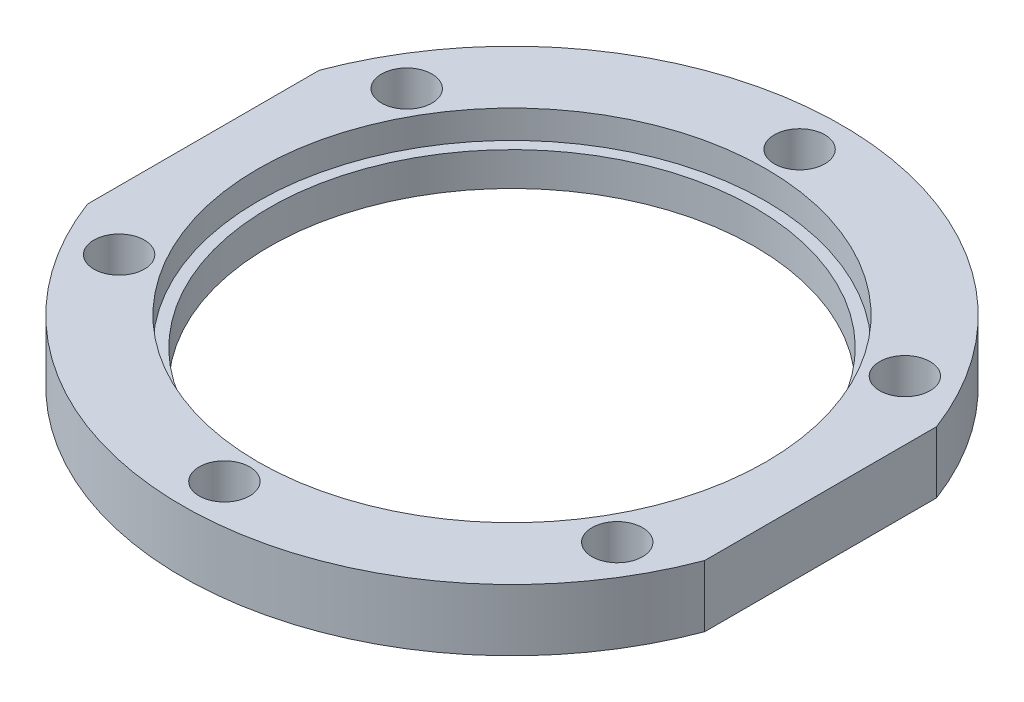
ISO-10303-21;
HEADER;
FILE_DESCRIPTION(('STEP AP214'),'2;1');
FILE_NAME('part.step','',(''),(''),'','','');
FILE_SCHEMA(('AUTOMOTIVE_DESIGN { 1 0 10303 214 1 1 1 1 }'));
ENDSEC;
DATA;
#1=APPLICATION_CONTEXT('core data for automotive mechanical design processes');
#2=APPLICATION_PROTOCOL_DEFINITION('international standard','automotive_design',2000,#1);
#3=PRODUCT_CONTEXT('',#1,'mechanical');
#4=PRODUCT('Part','Part','',(#3));
#5=PRODUCT_RELATED_PRODUCT_CATEGORY('part','',(#4));
#6=PRODUCT_DEFINITION_FORMATION('','',#4);
#7=PRODUCT_DEFINITION_CONTEXT('part definition',#1,'design');
#8=PRODUCT_DEFINITION('design','',#6,#7);
#9=PRODUCT_DEFINITION_SHAPE('','',#8);
#10=(LENGTH_UNIT() NAMED_UNIT(*) SI_UNIT(.MILLI.,.METRE.));
#11=(NAMED_UNIT(*) PLANE_ANGLE_UNIT() SI_UNIT($,.RADIAN.));
#12=(NAMED_UNIT(*) SI_UNIT($,.STERADIAN.) SOLID_ANGLE_UNIT());
#13=UNCERTAINTY_MEASURE_WITH_UNIT(LENGTH_MEASURE(1.E-05),#10,'distance_accuracy_value','');
#14=(GEOMETRIC_REPRESENTATION_CONTEXT(3) GLOBAL_UNCERTAINTY_ASSIGNED_CONTEXT((#13)) GLOBAL_UNIT_ASSIGNED_CONTEXT((#10,
#11,#12)) REPRESENTATION_CONTEXT('',''));
#15=CARTESIAN_POINT('',(0.,0.,0.));
#16=DIRECTION('',(0.,0.,1.));
#17=DIRECTION('',(1.,0.,0.));
#18=AXIS2_PLACEMENT_3D('',#15,#16,#17);
#19=CARTESIAN_POINT('',(0.,22.9348140994689,0.));
#20=DIRECTION('',(0.,1.,0.));
#21=DIRECTION('',(0.,0.,1.));
#22=AXIS2_PLACEMENT_3D('',#19,#20,#21);
#23=CYLINDRICAL_SURFACE('',#22,117.5);
#24=DIRECTION('',(0.,1.,0.));
#25=VECTOR('',#24,1.);
#26=CARTESIAN_POINT('',(110.,-22.,41.3067791046459));
#27=LINE('',#26,#25);
#28=CARTESIAN_POINT('',(110.,-22.,41.3067791046458));
#29=VERTEX_POINT('',#28);
#30=CARTESIAN_POINT('',(110.,0.,41.3067791046459));
#31=VERTEX_POINT('',#30);
#32=EDGE_CURVE('E50',#29,#31,#27,.T.);
#33=ORIENTED_EDGE('',*,*,#32,.T.);
#34=CARTESIAN_POINT('',(0.,0.,0.));
#35=DIRECTION('',(0.,1.,0.));
#36=DIRECTION('',(0.,0.,1.));
#37=AXIS2_PLACEMENT_3D('',#34,#35,#36);
#38=CIRCLE('',#37,117.5);
#39=CARTESIAN_POINT('',(-110.,0.,41.3067791046459));
#40=VERTEX_POINT('',#39);
#41=EDGE_CURVE('E43',#40,#31,#38,.T.);
#42=ORIENTED_EDGE('',*,*,#41,.F.);
#43=DIRECTION('',(0.,1.,0.));
#44=VECTOR('',#43,1.);
#45=CARTESIAN_POINT('',(-110.,-22.,41.3067791046459));
#46=LINE('',#45,#44);
#47=CARTESIAN_POINT('',(-110.,-22.,41.3067791046459));
#48=VERTEX_POINT('',#47);
#49=EDGE_CURVE('E111',#48,#40,#46,.T.);
#50=ORIENTED_EDGE('',*,*,#49,.F.);
#51=CARTESIAN_POINT('',(0.,-22.,0.));
#52=DIRECTION('',(0.,1.,0.));
#53=DIRECTION('',(0.,0.,1.));
#54=AXIS2_PLACEMENT_3D('',#51,#52,#53);
#55=CIRCLE('',#54,117.5);
#56=EDGE_CURVE('E92',#48,#29,#55,.T.);
#57=ORIENTED_EDGE('',*,*,#56,.T.);
#58=EDGE_LOOP('',(#33,#42,#50,#57));
#59=FACE_BOUND('',#58,.T.);
#60=ADVANCED_FACE('F35',(#59),#23,.T.);
#61=CARTESIAN_POINT('',(0.,22.9348140994689,0.));
#62=DIRECTION('',(0.,1.,0.));
#63=DIRECTION('',(0.,0.,1.));
#64=AXIS2_PLACEMENT_3D('',#61,#62,#63);
#65=CYLINDRICAL_SURFACE('',#64,90.5);
#66=CARTESIAN_POINT('',(0.,0.,0.));
#67=DIRECTION('',(0.,1.,0.));
#68=DIRECTION('',(0.,0.,1.));
#69=AXIS2_PLACEMENT_3D('',#66,#67,#68);
#70=CIRCLE('',#69,90.5);
#71=CARTESIAN_POINT('',(0.,0.,90.5));
#72=VERTEX_POINT('',#71);
#73=EDGE_CURVE('E11',#72,#72,#70,.T.);
#74=ORIENTED_EDGE('',*,*,#73,.T.);
#75=EDGE_LOOP('',(#74));
#76=FACE_BOUND('',#75,.T.);
#77=CARTESIAN_POINT('',(0.,-10.,0.));
#78=DIRECTION('',(0.,1.,0.));
#79=DIRECTION('',(0.,0.,1.));
#80=AXIS2_PLACEMENT_3D('',#77,#78,#79);
#81=CIRCLE('',#80,90.5);
#82=CARTESIAN_POINT('',(0.,-10.,90.5));
#83=VERTEX_POINT('',#82);
#84=EDGE_CURVE('E113',#83,#83,#81,.T.);
#85=ORIENTED_EDGE('',*,*,#84,.F.);
#86=EDGE_LOOP('',(#85));
#87=FACE_BOUND('',#86,.T.);
#88=ADVANCED_FACE('F37',(#76,#87),#65,.F.);
#89=CARTESIAN_POINT('',(-90.5,0.,0.));
#90=DIRECTION('',(0.,1.,0.));
#91=DIRECTION('',(0.,0.,1.));
#92=AXIS2_PLACEMENT_3D('',#89,#90,#91);
#93=PLANE('',#92);
#94=CARTESIAN_POINT('',(88.7676038879044,0.,-51.250000000001));
#95=DIRECTION('',(0.,1.,0.));
#96=DIRECTION('',(-0.866025403784433,0.,0.50000000000001));
#97=AXIS2_PLACEMENT_3D('',#94,#95,#96);
#98=CIRCLE('',#97,9.);
#99=CARTESIAN_POINT('',(80.9733752538445,0.,-46.7500000000009));
#100=VERTEX_POINT('',#99);
#101=EDGE_CURVE('E155',#100,#100,#98,.T.);
#102=ORIENTED_EDGE('',*,*,#101,.F.);
#103=EDGE_LOOP('',(#102));
#104=FACE_BOUND('',#103,.T.);
#105=CARTESIAN_POINT('',(88.7676038879054,0.,51.2499999999992));
#106=DIRECTION('',(0.,1.,0.));
#107=DIRECTION('',(-0.866025403784443,0.,-0.499999999999992));
#108=AXIS2_PLACEMENT_3D('',#105,#106,#107);
#109=CIRCLE('',#108,9.);
#110=CARTESIAN_POINT('',(80.9733752538454,0.,46.7499999999992));
#111=VERTEX_POINT('',#110);
#112=EDGE_CURVE('E159',#111,#111,#109,.T.);
#113=ORIENTED_EDGE('',*,*,#112,.F.);
#114=EDGE_LOOP('',(#113));
#115=FACE_BOUND('',#114,.T.);
#116=CARTESIAN_POINT('',(0.,0.,102.5));
#117=DIRECTION('',(0.,1.,0.));
#118=DIRECTION('',(0.,0.,-1.));
#119=AXIS2_PLACEMENT_3D('',#116,#117,#118);
#120=CIRCLE('',#119,9.);
#121=CARTESIAN_POINT('',(0.,0.,93.5));
#122=VERTEX_POINT('',#121);
#123=EDGE_CURVE('E163',#122,#122,#120,.T.);
#124=ORIENTED_EDGE('',*,*,#123,.F.);
#125=EDGE_LOOP('',(#124));
#126=FACE_BOUND('',#125,.T.);
#127=CARTESIAN_POINT('',(-88.7676038879047,0.,51.2500000000004));
#128=DIRECTION('',(0.,1.,0.));
#129=DIRECTION('',(0.866025403784436,0.,-0.500000000000004));
#130=AXIS2_PLACEMENT_3D('',#127,#128,#129);
#131=CIRCLE('',#130,9.);
#132=CARTESIAN_POINT('',(-80.9733752538448,0.,46.7500000000004));
#133=VERTEX_POINT('',#132);
#134=EDGE_CURVE('E167',#133,#133,#131,.T.);
#135=ORIENTED_EDGE('',*,*,#134,.F.);
#136=EDGE_LOOP('',(#135));
#137=FACE_BOUND('',#136,.T.);
#138=CARTESIAN_POINT('',(-88.7676038879051,0.,-51.2499999999998));
#139=DIRECTION('',(0.,1.,0.));
#140=DIRECTION('',(0.86602540378444,0.,0.499999999999998));
#141=AXIS2_PLACEMENT_3D('',#138,#139,#140);
#142=CIRCLE('',#141,9.);
#143=CARTESIAN_POINT('',(-80.9733752538451,0.,-46.7499999999998));
#144=VERTEX_POINT('',#143);
#145=EDGE_CURVE('E171',#144,#144,#142,.T.);
#146=ORIENTED_EDGE('',*,*,#145,.F.);
#147=EDGE_LOOP('',(#146));
#148=FACE_BOUND('',#147,.T.);
#149=CARTESIAN_POINT('',(0.,0.,-102.5));
#150=DIRECTION('',(0.,1.,0.));
#151=DIRECTION('',(0.,0.,1.));
#152=AXIS2_PLACEMENT_3D('',#149,#150,#151);
#153=CIRCLE('',#152,9.);
#154=CARTESIAN_POINT('',(0.,0.,-93.5));
#155=VERTEX_POINT('',#154);
#156=EDGE_CURVE('E174',#155,#155,#153,.T.);
#157=ORIENTED_EDGE('',*,*,#156,.F.);
#158=EDGE_LOOP('',(#157));
#159=FACE_BOUND('',#158,.T.);
#160=DIRECTION('',(0.,0.,1.));
#161=VECTOR('',#160,1.);
#162=CARTESIAN_POINT('',(110.,0.,-41.306779104646));
#163=LINE('',#162,#161);
#164=CARTESIAN_POINT('',(110.,0.,-41.306779104646));
#165=VERTEX_POINT('',#164);
#166=EDGE_CURVE('E82',#165,#31,#163,.T.);
#167=ORIENTED_EDGE('',*,*,#166,.F.);
#168=CARTESIAN_POINT('',(-110.,0.,-41.3067791046459));
#169=VERTEX_POINT('',#168);
#170=EDGE_CURVE('E86',#165,#169,#38,.T.);
#171=ORIENTED_EDGE('',*,*,#170,.T.);
#172=DIRECTION('',(0.,0.,-1.));
#173=VECTOR('',#172,1.);
#174=CARTESIAN_POINT('',(-110.,0.,-41.3067791046459));
#175=LINE('',#174,#173);
#176=EDGE_CURVE('E106',#40,#169,#175,.T.);
#177=ORIENTED_EDGE('',*,*,#176,.F.);
#178=ORIENTED_EDGE('',*,*,#41,.T.);
#179=EDGE_LOOP('',(#167,#171,#177,#178));
#180=FACE_BOUND('',#179,.T.);
#181=ORIENTED_EDGE('',*,*,#73,.F.);
#182=EDGE_LOOP('',(#181));
#183=FACE_BOUND('',#182,.T.);
#184=ADVANCED_FACE('F104',(#104,#115,#126,#137,#148,#159,#180,#183),#93,.T.);
#185=DIRECTION('',(0.,1.,0.));
#186=VECTOR('',#185,1.);
#187=CARTESIAN_POINT('',(110.,-22.,-41.306779104646));
#188=LINE('',#187,#186);
#189=CARTESIAN_POINT('',(110.,-22.,-41.306779104646));
#190=VERTEX_POINT('',#189);
#191=EDGE_CURVE('E77',#190,#165,#188,.T.);
#192=ORIENTED_EDGE('',*,*,#191,.F.);
#193=CARTESIAN_POINT('',(-110.,-22.,-41.3067791046459));
#194=VERTEX_POINT('',#193);
#195=EDGE_CURVE('E58',#190,#194,#55,.T.);
#196=ORIENTED_EDGE('',*,*,#195,.T.);
#197=DIRECTION('',(0.,1.,0.));
#198=VECTOR('',#197,1.);
#199=CARTESIAN_POINT('',(-110.,-22.,-41.3067791046459));
#200=LINE('',#199,#198);
#201=EDGE_CURVE('E109',#194,#169,#200,.T.);
#202=ORIENTED_EDGE('',*,*,#201,.T.);
#203=ORIENTED_EDGE('',*,*,#170,.F.);
#204=EDGE_LOOP('',(#192,#196,#202,#203));
#205=FACE_BOUND('',#204,.T.);
#206=ADVANCED_FACE('F85',(#205),#23,.T.);
#207=CARTESIAN_POINT('',(-117.5,-22.,0.));
#208=DIRECTION('',(0.,-1.,0.));
#209=DIRECTION('',(0.,0.,-1.));
#210=AXIS2_PLACEMENT_3D('',#207,#208,#209);
#211=PLANE('',#210);
#212=CARTESIAN_POINT('',(88.7676038879044,-22.,-51.250000000001));
#213=DIRECTION('',(0.,1.,0.));
#214=DIRECTION('',(-0.866025403784433,0.,0.50000000000001));
#215=AXIS2_PLACEMENT_3D('',#212,#213,#214);
#216=CIRCLE('',#215,9.);
#217=CARTESIAN_POINT('',(80.9733752538445,-22.,-46.7500000000009));
#218=VERTEX_POINT('',#217);
#219=EDGE_CURVE('E197',#218,#218,#216,.T.);
#220=ORIENTED_EDGE('',*,*,#219,.T.);
#221=EDGE_LOOP('',(#220));
#222=FACE_BOUND('',#221,.T.);
#223=CARTESIAN_POINT('',(88.7676038879054,-22.,51.2499999999992));
#224=DIRECTION('',(0.,1.,0.));
#225=DIRECTION('',(-0.866025403784443,0.,-0.499999999999992));
#226=AXIS2_PLACEMENT_3D('',#223,#224,#225);
#227=CIRCLE('',#226,9.);
#228=CARTESIAN_POINT('',(80.9733752538454,-22.,46.7499999999992));
#229=VERTEX_POINT('',#228);
#230=EDGE_CURVE('E193',#229,#229,#227,.T.);
#231=ORIENTED_EDGE('',*,*,#230,.T.);
#232=EDGE_LOOP('',(#231));
#233=FACE_BOUND('',#232,.T.);
#234=CARTESIAN_POINT('',(0.,-22.,102.5));
#235=DIRECTION('',(0.,1.,0.));
#236=DIRECTION('',(0.,0.,-1.));
#237=AXIS2_PLACEMENT_3D('',#234,#235,#236);
#238=CIRCLE('',#237,9.);
#239=CARTESIAN_POINT('',(0.,-22.,93.5));
#240=VERTEX_POINT('',#239);
#241=EDGE_CURVE('E189',#240,#240,#238,.T.);
#242=ORIENTED_EDGE('',*,*,#241,.T.);
#243=EDGE_LOOP('',(#242));
#244=FACE_BOUND('',#243,.T.);
#245=CARTESIAN_POINT('',(-88.7676038879047,-22.,51.2500000000004));
#246=DIRECTION('',(0.,1.,0.));
#247=DIRECTION('',(0.866025403784436,0.,-0.500000000000004));
#248=AXIS2_PLACEMENT_3D('',#245,#246,#247);
#249=CIRCLE('',#248,9.);
#250=CARTESIAN_POINT('',(-80.9733752538448,-22.,46.7500000000004));
#251=VERTEX_POINT('',#250);
#252=EDGE_CURVE('E186',#251,#251,#249,.T.);
#253=ORIENTED_EDGE('',*,*,#252,.T.);
#254=EDGE_LOOP('',(#253));
#255=FACE_BOUND('',#254,.T.);
#256=CARTESIAN_POINT('',(-88.7676038879051,-22.,-51.2499999999998));
#257=DIRECTION('',(0.,1.,0.));
#258=DIRECTION('',(0.86602540378444,0.,0.499999999999998));
#259=AXIS2_PLACEMENT_3D('',#256,#257,#258);
#260=CIRCLE('',#259,9.);
#261=CARTESIAN_POINT('',(-80.9733752538451,-22.,-46.7499999999998));
#262=VERTEX_POINT('',#261);
#263=EDGE_CURVE('E177',#262,#262,#260,.T.);
#264=ORIENTED_EDGE('',*,*,#263,.T.);
#265=EDGE_LOOP('',(#264));
#266=FACE_BOUND('',#265,.T.);
#267=CARTESIAN_POINT('',(0.,-22.,-102.5));
#268=DIRECTION('',(0.,1.,0.));
#269=DIRECTION('',(0.,0.,1.));
#270=AXIS2_PLACEMENT_3D('',#267,#268,#269);
#271=CIRCLE('',#270,9.);
#272=CARTESIAN_POINT('',(0.,-22.,-93.5));
#273=VERTEX_POINT('',#272);
#274=EDGE_CURVE('E176',#273,#273,#271,.T.);
#275=ORIENTED_EDGE('',*,*,#274,.T.);
#276=EDGE_LOOP('',(#275));
#277=FACE_BOUND('',#276,.T.);
#278=DIRECTION('',(0.,0.,1.));
#279=VECTOR('',#278,1.);
#280=CARTESIAN_POINT('',(110.,-22.,-41.306779104646));
#281=LINE('',#280,#279);
#282=EDGE_CURVE('E75',#190,#29,#281,.T.);
#283=ORIENTED_EDGE('',*,*,#282,.T.);
#284=ORIENTED_EDGE('',*,*,#56,.F.);
#285=DIRECTION('',(0.,0.,-1.));
#286=VECTOR('',#285,1.);
#287=CARTESIAN_POINT('',(-110.,-22.,-41.3067791046459));
#288=LINE('',#287,#286);
#289=EDGE_CURVE('E91',#48,#194,#288,.T.);
#290=ORIENTED_EDGE('',*,*,#289,.T.);
#291=ORIENTED_EDGE('',*,*,#195,.F.);
#292=EDGE_LOOP('',(#283,#284,#290,#291));
#293=FACE_BOUND('',#292,.T.);
#294=CARTESIAN_POINT('',(0.,-22.,0.));
#295=DIRECTION('',(0.,1.,0.));
#296=DIRECTION('',(0.,0.,1.));
#297=AXIS2_PLACEMENT_3D('',#294,#295,#296);
#298=CIRCLE('',#297,86.5);
#299=CARTESIAN_POINT('',(0.,-22.,86.5));
#300=VERTEX_POINT('',#299);
#301=EDGE_CURVE('E93',#300,#300,#298,.T.);
#302=ORIENTED_EDGE('',*,*,#301,.T.);
#303=EDGE_LOOP('',(#302));
#304=FACE_BOUND('',#303,.T.);
#305=ADVANCED_FACE('F89',(#222,#233,#244,#255,#266,#277,#293,#304),#211,.T.);
#306=CARTESIAN_POINT('',(0.,22.9348140994689,0.));
#307=DIRECTION('',(0.,1.,0.));
#308=DIRECTION('',(0.,0.,1.));
#309=AXIS2_PLACEMENT_3D('',#306,#307,#308);
#310=CYLINDRICAL_SURFACE('',#309,86.5);
#311=CARTESIAN_POINT('',(0.,-10.,0.));
#312=DIRECTION('',(0.,1.,0.));
#313=DIRECTION('',(0.,0.,1.));
#314=AXIS2_PLACEMENT_3D('',#311,#312,#313);
#315=CIRCLE('',#314,86.5);
#316=CARTESIAN_POINT('',(0.,-10.,86.5));
#317=VERTEX_POINT('',#316);
#318=EDGE_CURVE('E96',#317,#317,#315,.T.);
#319=ORIENTED_EDGE('',*,*,#318,.T.);
#320=EDGE_LOOP('',(#319));
#321=FACE_BOUND('',#320,.T.);
#322=ORIENTED_EDGE('',*,*,#301,.F.);
#323=EDGE_LOOP('',(#322));
#324=FACE_BOUND('',#323,.T.);
#325=ADVANCED_FACE('F122',(#321,#324),#310,.F.);
#326=CARTESIAN_POINT('',(-86.5,-10.,0.));
#327=DIRECTION('',(0.,1.,0.));
#328=DIRECTION('',(0.,0.,1.));
#329=AXIS2_PLACEMENT_3D('',#326,#327,#328);
#330=PLANE('',#329);
#331=ORIENTED_EDGE('',*,*,#84,.T.);
#332=EDGE_LOOP('',(#331));
#333=FACE_BOUND('',#332,.T.);
#334=ORIENTED_EDGE('',*,*,#318,.F.);
#335=EDGE_LOOP('',(#334));
#336=FACE_BOUND('',#335,.T.);
#337=ADVANCED_FACE('F125',(#333,#336),#330,.T.);
#338=CARTESIAN_POINT('',(-110.,-22.,-41.3067791046459));
#339=DIRECTION('',(1.,0.,0.));
#340=DIRECTION('',(0.,0.,-1.));
#341=AXIS2_PLACEMENT_3D('',#338,#339,#340);
#342=PLANE('',#341);
#343=ORIENTED_EDGE('',*,*,#176,.T.);
#344=ORIENTED_EDGE('',*,*,#201,.F.);
#345=ORIENTED_EDGE('',*,*,#289,.F.);
#346=ORIENTED_EDGE('',*,*,#49,.T.);
#347=EDGE_LOOP('',(#343,#344,#345,#346));
#348=FACE_BOUND('',#347,.T.);
#349=ADVANCED_FACE('F108',(#348),#342,.F.);
#350=CARTESIAN_POINT('',(110.,-22.,-41.306779104646));
#351=DIRECTION('',(-1.,0.,0.));
#352=DIRECTION('',(0.,0.,1.));
#353=AXIS2_PLACEMENT_3D('',#350,#351,#352);
#354=PLANE('',#353);
#355=ORIENTED_EDGE('',*,*,#166,.T.);
#356=ORIENTED_EDGE('',*,*,#32,.F.);
#357=ORIENTED_EDGE('',*,*,#282,.F.);
#358=ORIENTED_EDGE('',*,*,#191,.T.);
#359=EDGE_LOOP('',(#355,#356,#357,#358));
#360=FACE_BOUND('',#359,.T.);
#361=ADVANCED_FACE('F76',(#360),#354,.F.);
#362=CARTESIAN_POINT('',(0.,-22.,-102.5));
#363=DIRECTION('',(0.,1.,0.));
#364=DIRECTION('',(0.,0.,1.));
#365=AXIS2_PLACEMENT_3D('',#362,#363,#364);
#366=CYLINDRICAL_SURFACE('',#365,9.);
#367=ORIENTED_EDGE('',*,*,#274,.F.);
#368=EDGE_LOOP('',(#367));
#369=FACE_BOUND('',#368,.T.);
#370=ORIENTED_EDGE('',*,*,#156,.T.);
#371=EDGE_LOOP('',(#370));
#372=FACE_BOUND('',#371,.T.);
#373=ADVANCED_FACE('F227',(#369,#372),#366,.F.);
#374=CARTESIAN_POINT('',(-88.7676038879051,-22.,-51.2499999999998));
#375=DIRECTION('',(0.,1.,0.));
#376=DIRECTION('',(0.,0.,1.));
#377=AXIS2_PLACEMENT_3D('',#374,#375,#376);
#378=CYLINDRICAL_SURFACE('',#377,9.);
#379=ORIENTED_EDGE('',*,*,#263,.F.);
#380=EDGE_LOOP('',(#379));
#381=FACE_BOUND('',#380,.T.);
#382=ORIENTED_EDGE('',*,*,#145,.T.);
#383=EDGE_LOOP('',(#382));
#384=FACE_BOUND('',#383,.T.);
#385=ADVANCED_FACE('F223',(#381,#384),#378,.F.);
#386=CARTESIAN_POINT('',(-88.7676038879047,-22.,51.2500000000004));
#387=DIRECTION('',(0.,1.,0.));
#388=DIRECTION('',(0.,0.,1.));
#389=AXIS2_PLACEMENT_3D('',#386,#387,#388);
#390=CYLINDRICAL_SURFACE('',#389,9.);
#391=ORIENTED_EDGE('',*,*,#252,.F.);
#392=EDGE_LOOP('',(#391));
#393=FACE_BOUND('',#392,.T.);
#394=ORIENTED_EDGE('',*,*,#134,.T.);
#395=EDGE_LOOP('',(#394));
#396=FACE_BOUND('',#395,.T.);
#397=ADVANCED_FACE('F219',(#393,#396),#390,.F.);
#398=CARTESIAN_POINT('',(0.,-22.,102.5));
#399=DIRECTION('',(0.,1.,0.));
#400=DIRECTION('',(0.,0.,1.));
#401=AXIS2_PLACEMENT_3D('',#398,#399,#400);
#402=CYLINDRICAL_SURFACE('',#401,9.);
#403=ORIENTED_EDGE('',*,*,#241,.F.);
#404=EDGE_LOOP('',(#403));
#405=FACE_BOUND('',#404,.T.);
#406=ORIENTED_EDGE('',*,*,#123,.T.);
#407=EDGE_LOOP('',(#406));
#408=FACE_BOUND('',#407,.T.);
#409=ADVANCED_FACE('F213',(#405,#408),#402,.F.);
#410=CARTESIAN_POINT('',(88.7676038879054,-22.,51.2499999999992));
#411=DIRECTION('',(0.,1.,0.));
#412=DIRECTION('',(0.,0.,1.));
#413=AXIS2_PLACEMENT_3D('',#410,#411,#412);
#414=CYLINDRICAL_SURFACE('',#413,9.);
#415=ORIENTED_EDGE('',*,*,#230,.F.);
#416=EDGE_LOOP('',(#415));
#417=FACE_BOUND('',#416,.T.);
#418=ORIENTED_EDGE('',*,*,#112,.T.);
#419=EDGE_LOOP('',(#418));
#420=FACE_BOUND('',#419,.T.);
#421=ADVANCED_FACE('F208',(#417,#420),#414,.F.);
#422=CARTESIAN_POINT('',(88.7676038879044,-22.,-51.250000000001));
#423=DIRECTION('',(0.,1.,0.));
#424=DIRECTION('',(0.,0.,1.));
#425=AXIS2_PLACEMENT_3D('',#422,#423,#424);
#426=CYLINDRICAL_SURFACE('',#425,9.);
#427=ORIENTED_EDGE('',*,*,#219,.F.);
#428=EDGE_LOOP('',(#427));
#429=FACE_BOUND('',#428,.T.);
#430=ORIENTED_EDGE('',*,*,#101,.T.);
#431=EDGE_LOOP('',(#430));
#432=FACE_BOUND('',#431,.T.);
#433=ADVANCED_FACE('F205',(#429,#432),#426,.F.);
#434=CLOSED_SHELL('',(#60,#88,#184,#206,#305,#325,#337,#349,#361,#373,#385,#397,#409,#421,#433));
#435=MANIFOLD_SOLID_BREP('B2',#434);
#436=ADVANCED_BREP_SHAPE_REPRESENTATION('',(#18,#435),#14);
#437=SHAPE_DEFINITION_REPRESENTATION(#9,#436);
ENDSEC;
END-ISO-10303-21;
